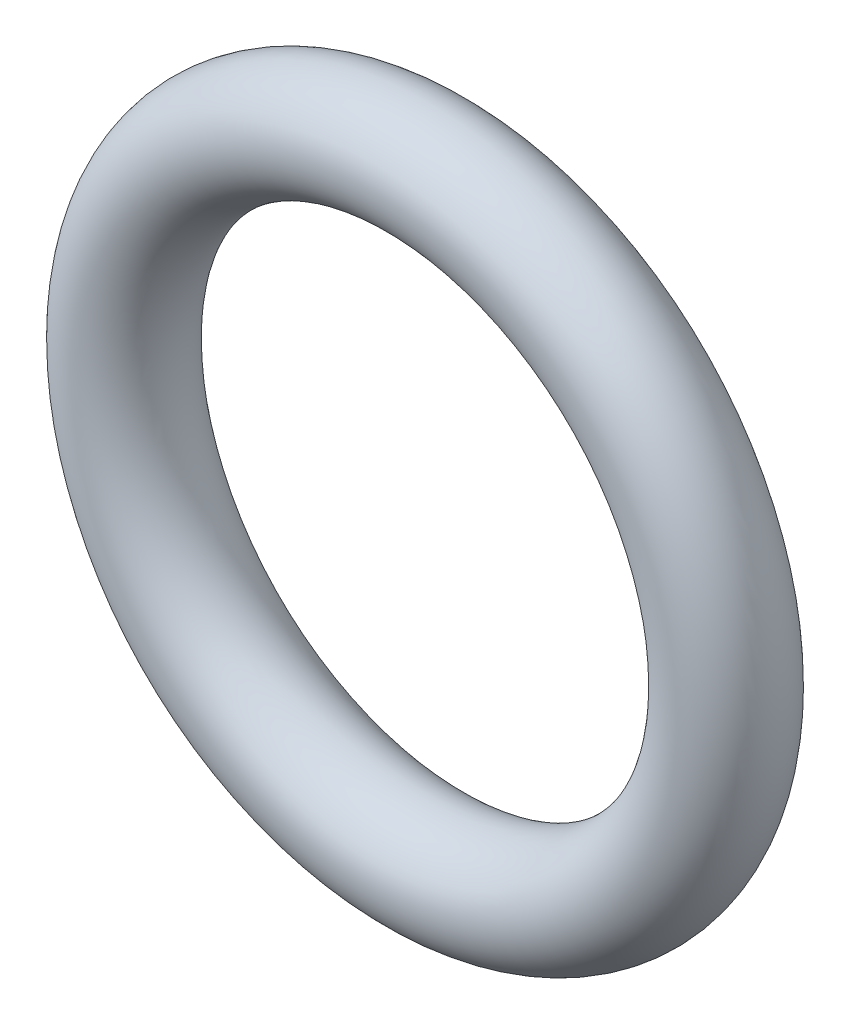
ISO-10303-21;
HEADER;
FILE_DESCRIPTION(('STEP AP214'),'2;1');
FILE_NAME('part.step','',(''),(''),'','','');
FILE_SCHEMA(('AUTOMOTIVE_DESIGN { 1 0 10303 214 1 1 1 1 }'));
ENDSEC;
DATA;
#1=APPLICATION_CONTEXT('core data for automotive mechanical design processes');
#2=APPLICATION_PROTOCOL_DEFINITION('international standard','automotive_design',2000,#1);
#3=PRODUCT_CONTEXT('',#1,'mechanical');
#4=PRODUCT('Part','Part','',(#3));
#5=PRODUCT_RELATED_PRODUCT_CATEGORY('part','',(#4));
#6=PRODUCT_DEFINITION_FORMATION('','',#4);
#7=PRODUCT_DEFINITION_CONTEXT('part definition',#1,'design');
#8=PRODUCT_DEFINITION('design','',#6,#7);
#9=PRODUCT_DEFINITION_SHAPE('','',#8);
#10=(LENGTH_UNIT() NAMED_UNIT(*) SI_UNIT(.MILLI.,.METRE.));
#11=(NAMED_UNIT(*) PLANE_ANGLE_UNIT() SI_UNIT($,.RADIAN.));
#12=(NAMED_UNIT(*) SI_UNIT($,.STERADIAN.) SOLID_ANGLE_UNIT());
#13=UNCERTAINTY_MEASURE_WITH_UNIT(LENGTH_MEASURE(1.E-05),#10,'distance_accuracy_value','');
#14=(GEOMETRIC_REPRESENTATION_CONTEXT(3) GLOBAL_UNCERTAINTY_ASSIGNED_CONTEXT((#13)) GLOBAL_UNIT_ASSIGNED_CONTEXT((#10,
#11,#12)) REPRESENTATION_CONTEXT('',''));
#15=CARTESIAN_POINT('',(0.,0.,0.));
#16=DIRECTION('',(0.,0.,1.));
#17=DIRECTION('',(1.,0.,0.));
#18=AXIS2_PLACEMENT_3D('',#15,#16,#17);
#19=CARTESIAN_POINT('',(0.,0.,-1.5));
#20=DIRECTION('',(0.,0.,0.999999999999999));
#21=DIRECTION('',(1.,0.,0.));
#22=AXIS2_PLACEMENT_3D('',#19,#20,#21);
#23=TOROIDAL_SURFACE('',#22,8.25,1.5);
#24=CARTESIAN_POINT('',(9.75000000000001,0.,-1.5));
#25=VERTEX_POINT('',#24);
#26=VERTEX_LOOP('',#25);
#27=FACE_BOUND('',#26,.T.);
#28=ADVANCED_FACE('F30',(#27),#23,.T.);
#29=CLOSED_SHELL('',(#28));
#30=MANIFOLD_SOLID_BREP('B2',#29);
#31=ADVANCED_BREP_SHAPE_REPRESENTATION('',(#18,#30),#14);
#32=SHAPE_DEFINITION_REPRESENTATION(#9,#31);
ENDSEC;
END-ISO-10303-21;
